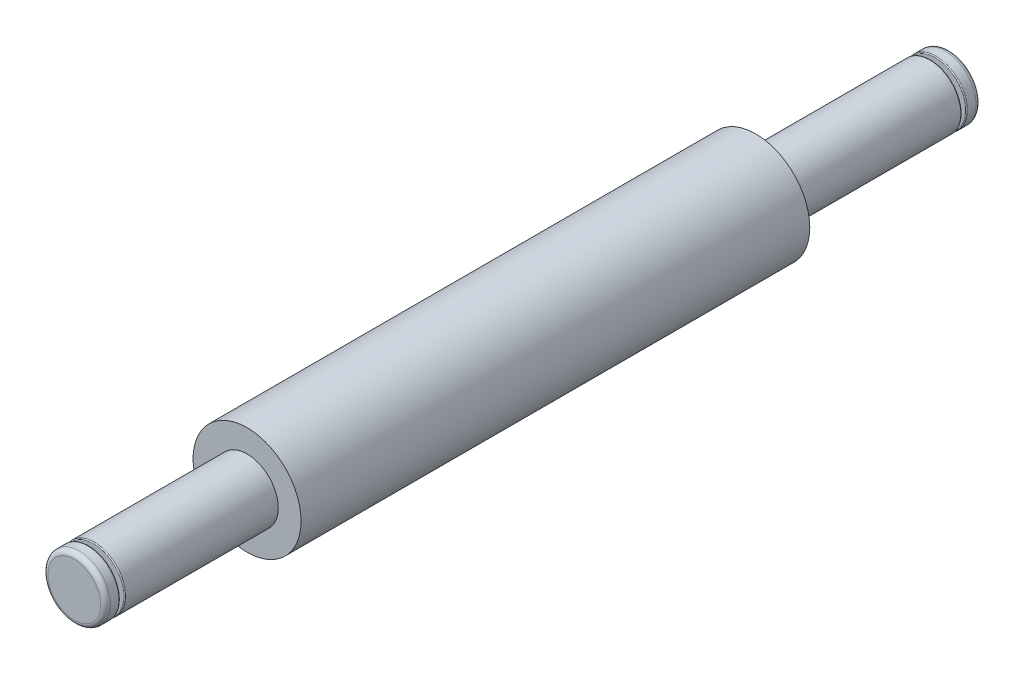
ISO-10303-21;
HEADER;
FILE_DESCRIPTION(('STEP AP214'),'2;1');
FILE_NAME('part.step','',(''),(''),'','','');
FILE_SCHEMA(('AUTOMOTIVE_DESIGN { 1 0 10303 214 1 1 1 1 }'));
ENDSEC;
DATA;
#1=APPLICATION_CONTEXT('core data for automotive mechanical design processes');
#2=APPLICATION_PROTOCOL_DEFINITION('international standard','automotive_design',2000,#1);
#3=PRODUCT_CONTEXT('',#1,'mechanical');
#4=PRODUCT('Part','Part','',(#3));
#5=PRODUCT_RELATED_PRODUCT_CATEGORY('part','',(#4));
#6=PRODUCT_DEFINITION_FORMATION('','',#4);
#7=PRODUCT_DEFINITION_CONTEXT('part definition',#1,'design');
#8=PRODUCT_DEFINITION('design','',#6,#7);
#9=PRODUCT_DEFINITION_SHAPE('','',#8);
#10=(LENGTH_UNIT() NAMED_UNIT(*) SI_UNIT(.MILLI.,.METRE.));
#11=(NAMED_UNIT(*) PLANE_ANGLE_UNIT() SI_UNIT($,.RADIAN.));
#12=(NAMED_UNIT(*) SI_UNIT($,.STERADIAN.) SOLID_ANGLE_UNIT());
#13=UNCERTAINTY_MEASURE_WITH_UNIT(LENGTH_MEASURE(1.E-05),#10,'distance_accuracy_value','');
#14=(GEOMETRIC_REPRESENTATION_CONTEXT(3) GLOBAL_UNCERTAINTY_ASSIGNED_CONTEXT((#13)) GLOBAL_UNIT_ASSIGNED_CONTEXT((#10,
#11,#12)) REPRESENTATION_CONTEXT('',''));
#15=CARTESIAN_POINT('',(0.,0.,0.));
#16=DIRECTION('',(0.,0.,1.));
#17=DIRECTION('',(1.,0.,0.));
#18=AXIS2_PLACEMENT_3D('',#15,#16,#17);
#19=CARTESIAN_POINT('',(-222.185360959143,59.6173462163521,-53.));
#20=DIRECTION('',(0.,0.,1.));
#21=DIRECTION('',(1.,0.,0.));
#22=AXIS2_PLACEMENT_3D('',#19,#20,#21);
#23=CYLINDRICAL_SURFACE('',#22,5.62500000000002);
#24=CARTESIAN_POINT('',(-222.185360959143,59.6173462163521,-53.));
#25=DIRECTION('',(0.,0.,1.));
#26=DIRECTION('',(1.,0.,0.));
#27=AXIS2_PLACEMENT_3D('',#24,#25,#26);
#28=CIRCLE('',#27,5.62500000000002);
#29=CARTESIAN_POINT('',(-216.560360959143,59.6173462163521,-53.));
#30=VERTEX_POINT('',#29);
#31=EDGE_CURVE('E80',#30,#30,#28,.T.);
#32=ORIENTED_EDGE('',*,*,#31,.T.);
#33=EDGE_LOOP('',(#32));
#34=FACE_BOUND('',#33,.T.);
#35=CARTESIAN_POINT('',(-222.185360959143,59.6173462163521,0.));
#36=DIRECTION('',(0.,0.,1.));
#37=DIRECTION('',(1.,0.,0.));
#38=AXIS2_PLACEMENT_3D('',#35,#36,#37);
#39=CIRCLE('',#38,5.62500000000002);
#40=CARTESIAN_POINT('',(-216.560360959143,59.6173462163521,0.));
#41=VERTEX_POINT('',#40);
#42=EDGE_CURVE('E81',#41,#41,#39,.T.);
#43=ORIENTED_EDGE('',*,*,#42,.F.);
#44=EDGE_LOOP('',(#43));
#45=FACE_BOUND('',#44,.T.);
#46=ADVANCED_FACE('F31',(#34,#45),#23,.T.);
#47=CARTESIAN_POINT('',(-222.185360959143,59.6173462163521,-53.));
#48=DIRECTION('',(0.,0.,1.));
#49=DIRECTION('',(1.,0.,0.));
#50=AXIS2_PLACEMENT_3D('',#47,#48,#49);
#51=PLANE('',#50);
#52=CARTESIAN_POINT('',(-222.185360959143,59.6173462163521,-53.));
#53=DIRECTION('',(0.,0.,1.));
#54=DIRECTION('',(1.,0.,0.));
#55=AXIS2_PLACEMENT_3D('',#52,#53,#54);
#56=CIRCLE('',#55,3.25000000000001);
#57=CARTESIAN_POINT('',(-218.935360959143,59.6173462163521,-53.));
#58=VERTEX_POINT('',#57);
#59=EDGE_CURVE('E84',#58,#58,#56,.T.);
#60=ORIENTED_EDGE('',*,*,#59,.T.);
#61=EDGE_LOOP('',(#60));
#62=FACE_BOUND('',#61,.T.);
#63=ORIENTED_EDGE('',*,*,#31,.F.);
#64=EDGE_LOOP('',(#63));
#65=FACE_BOUND('',#64,.T.);
#66=ADVANCED_FACE('F126',(#62,#65),#51,.F.);
#67=CARTESIAN_POINT('',(-222.185360959143,59.6173462163521,0.));
#68=DIRECTION('',(0.,0.,1.));
#69=DIRECTION('',(1.,0.,0.));
#70=AXIS2_PLACEMENT_3D('',#67,#68,#69);
#71=PLANE('',#70);
#72=CARTESIAN_POINT('',(-222.185360959143,59.6173462163521,0.));
#73=DIRECTION('',(0.,0.,1.));
#74=DIRECTION('',(1.,0.,0.));
#75=AXIS2_PLACEMENT_3D('',#72,#73,#74);
#76=CIRCLE('',#75,3.25000000000001);
#77=CARTESIAN_POINT('',(-218.935360959143,59.6173462163521,0.));
#78=VERTEX_POINT('',#77);
#79=EDGE_CURVE('E76',#78,#78,#76,.T.);
#80=ORIENTED_EDGE('',*,*,#79,.F.);
#81=EDGE_LOOP('',(#80));
#82=FACE_BOUND('',#81,.T.);
#83=ORIENTED_EDGE('',*,*,#42,.T.);
#84=EDGE_LOOP('',(#83));
#85=FACE_BOUND('',#84,.T.);
#86=ADVANCED_FACE('F132',(#82,#85),#71,.T.);
#87=CARTESIAN_POINT('',(-222.185360959143,59.6173462163521,16.));
#88=DIRECTION('',(0.,0.,1.));
#89=DIRECTION('',(1.,0.,0.));
#90=AXIS2_PLACEMENT_3D('',#87,#88,#89);
#91=PLANE('',#90);
#92=CARTESIAN_POINT('',(-222.185360959143,59.6173462163521,16.));
#93=DIRECTION('',(0.,0.,1.));
#94=DIRECTION('',(1.,0.,0.));
#95=AXIS2_PLACEMENT_3D('',#92,#93,#94);
#96=CIRCLE('',#95,3.15000000000001);
#97=CARTESIAN_POINT('',(-219.035360959143,59.6173462163521,16.));
#98=VERTEX_POINT('',#97);
#99=EDGE_CURVE('E54',#98,#98,#96,.T.);
#100=ORIENTED_EDGE('',*,*,#99,.T.);
#101=EDGE_LOOP('',(#100));
#102=FACE_BOUND('',#101,.T.);
#103=CARTESIAN_POINT('',(-222.185360959143,59.6173462163521,16.));
#104=DIRECTION('',(0.,0.,1.));
#105=DIRECTION('',(1.,0.,0.));
#106=AXIS2_PLACEMENT_3D('',#103,#104,#105);
#107=CIRCLE('',#106,1.75000000000001);
#108=CARTESIAN_POINT('',(-220.435360959143,59.6173462163521,16.));
#109=VERTEX_POINT('',#108);
#110=EDGE_CURVE('E79',#109,#109,#107,.T.);
#111=ORIENTED_EDGE('',*,*,#110,.F.);
#112=EDGE_LOOP('',(#111));
#113=FACE_BOUND('',#112,.T.);
#114=ADVANCED_FACE('F185',(#102,#113),#91,.T.);
#115=CARTESIAN_POINT('',(-222.185360959143,59.6173462163521,-71.2));
#116=DIRECTION('',(0.,0.,1.));
#117=DIRECTION('',(1.,0.,0.));
#118=AXIS2_PLACEMENT_3D('',#115,#116,#117);
#119=CYLINDRICAL_SURFACE('',#118,3.25000000000001);
#120=CARTESIAN_POINT('',(-222.185360959143,59.6173462163521,15.9));
#121=DIRECTION('',(0.,0.,1.));
#122=DIRECTION('',(1.,0.,0.));
#123=AXIS2_PLACEMENT_3D('',#120,#121,#122);
#124=CIRCLE('',#123,3.25000000000001);
#125=CARTESIAN_POINT('',(-218.935360959143,59.6173462163521,15.9));
#126=VERTEX_POINT('',#125);
#127=EDGE_CURVE('E51',#126,#126,#124,.F.);
#128=ORIENTED_EDGE('',*,*,#127,.T.);
#129=EDGE_LOOP('',(#128));
#130=FACE_BOUND('',#129,.T.);
#131=ORIENTED_EDGE('',*,*,#79,.T.);
#132=EDGE_LOOP('',(#131));
#133=FACE_BOUND('',#132,.T.);
#134=ADVANCED_FACE('F121',(#130,#133),#119,.T.);
#135=CARTESIAN_POINT('',(-222.185360959143,59.6173462163521,-71.1));
#136=DIRECTION('',(0.,0.,1.));
#137=DIRECTION('',(1.,0.,0.));
#138=AXIS2_PLACEMENT_3D('',#135,#136,#137);
#139=CIRCLE('',#138,3.25000000000001);
#140=CARTESIAN_POINT('',(-218.935360959143,59.6173462163521,-71.1));
#141=VERTEX_POINT('',#140);
#142=EDGE_CURVE('E72',#141,#141,#139,.T.);
#143=ORIENTED_EDGE('',*,*,#142,.T.);
#144=EDGE_LOOP('',(#143));
#145=FACE_BOUND('',#144,.T.);
#146=ORIENTED_EDGE('',*,*,#59,.F.);
#147=EDGE_LOOP('',(#146));
#148=FACE_BOUND('',#147,.T.);
#149=ADVANCED_FACE('F112',(#145,#148),#119,.T.);
#150=CARTESIAN_POINT('',(-222.185360959143,59.6173462163521,-71.2));
#151=DIRECTION('',(0.,0.,1.));
#152=DIRECTION('',(1.,0.,0.));
#153=AXIS2_PLACEMENT_3D('',#150,#151,#152);
#154=PLANE('',#153);
#155=CARTESIAN_POINT('',(-222.185360959143,59.6173462163521,-71.2));
#156=DIRECTION('',(0.,0.,1.));
#157=DIRECTION('',(1.,0.,0.));
#158=AXIS2_PLACEMENT_3D('',#155,#156,#157);
#159=CIRCLE('',#158,3.15000000000001);
#160=CARTESIAN_POINT('',(-219.035360959143,59.6173462163521,-71.2));
#161=VERTEX_POINT('',#160);
#162=EDGE_CURVE('E69',#161,#161,#159,.F.);
#163=ORIENTED_EDGE('',*,*,#162,.T.);
#164=EDGE_LOOP('',(#163));
#165=FACE_BOUND('',#164,.T.);
#166=CARTESIAN_POINT('',(-222.185360959143,59.6173462163521,-71.2));
#167=DIRECTION('',(0.,0.,-1.));
#168=DIRECTION('',(-1.,0.,0.));
#169=AXIS2_PLACEMENT_3D('',#166,#167,#168);
#170=CIRCLE('',#169,1.75000000000004);
#171=CARTESIAN_POINT('',(-223.935360959143,59.6173462163521,-71.2));
#172=VERTEX_POINT('',#171);
#173=EDGE_CURVE('E75',#172,#172,#170,.T.);
#174=ORIENTED_EDGE('',*,*,#173,.F.);
#175=EDGE_LOOP('',(#174));
#176=FACE_BOUND('',#175,.T.);
#177=ADVANCED_FACE('F110',(#165,#176),#154,.F.);
#178=CARTESIAN_POINT('',(-222.185360959143,59.6173462163521,16.5));
#179=DIRECTION('',(0.,0.,-1.));
#180=DIRECTION('',(-1.,0.,0.));
#181=AXIS2_PLACEMENT_3D('',#178,#179,#180);
#182=CYLINDRICAL_SURFACE('',#181,1.75000000000001);
#183=CARTESIAN_POINT('',(-222.185360959143,59.6173462163521,16.5));
#184=DIRECTION('',(0.,0.,1.));
#185=DIRECTION('',(1.,0.,0.));
#186=AXIS2_PLACEMENT_3D('',#183,#184,#185);
#187=CIRCLE('',#186,1.75000000000001);
#188=CARTESIAN_POINT('',(-220.435360959143,59.6173462163521,16.5));
#189=VERTEX_POINT('',#188);
#190=EDGE_CURVE('E89',#189,#189,#187,.T.);
#191=ORIENTED_EDGE('',*,*,#190,.F.);
#192=EDGE_LOOP('',(#191));
#193=FACE_BOUND('',#192,.T.);
#194=ORIENTED_EDGE('',*,*,#110,.T.);
#195=EDGE_LOOP('',(#194));
#196=FACE_BOUND('',#195,.T.);
#197=ADVANCED_FACE('F106',(#193,#196),#182,.T.);
#198=CARTESIAN_POINT('',(-222.185360959143,59.6173462163521,-71.7));
#199=DIRECTION('',(0.,0.,1.));
#200=DIRECTION('',(1.,0.,0.));
#201=AXIS2_PLACEMENT_3D('',#198,#199,#200);
#202=CYLINDRICAL_SURFACE('',#201,1.75000000000004);
#203=CARTESIAN_POINT('',(-222.185360959143,59.6173462163521,-71.7));
#204=DIRECTION('',(0.,0.,-1.));
#205=DIRECTION('',(-1.,0.,0.));
#206=AXIS2_PLACEMENT_3D('',#203,#204,#205);
#207=CIRCLE('',#206,1.75000000000004);
#208=CARTESIAN_POINT('',(-223.935360959143,59.6173462163521,-71.7));
#209=VERTEX_POINT('',#208);
#210=EDGE_CURVE('E94',#209,#209,#207,.T.);
#211=ORIENTED_EDGE('',*,*,#210,.F.);
#212=EDGE_LOOP('',(#211));
#213=FACE_BOUND('',#212,.T.);
#214=ORIENTED_EDGE('',*,*,#173,.T.);
#215=EDGE_LOOP('',(#214));
#216=FACE_BOUND('',#215,.T.);
#217=ADVANCED_FACE('F102',(#213,#216),#202,.T.);
#218=CARTESIAN_POINT('',(-222.185360959143,59.6173462163521,-73.2));
#219=DIRECTION('',(0.,0.,1.));
#220=DIRECTION('',(1.,0.,0.));
#221=AXIS2_PLACEMENT_3D('',#218,#219,#220);
#222=CYLINDRICAL_SURFACE('',#221,3.25000000000001);
#223=CARTESIAN_POINT('',(-222.185360959143,59.6173462163521,-72.7));
#224=DIRECTION('',(0.,0.,-1.));
#225=DIRECTION('',(-1.,0.,0.));
#226=AXIS2_PLACEMENT_3D('',#223,#224,#225);
#227=CIRCLE('',#226,3.25000000000001);
#228=CARTESIAN_POINT('',(-225.435360959143,59.6173462163521,-72.7));
#229=VERTEX_POINT('',#228);
#230=EDGE_CURVE('E10',#229,#229,#227,.F.);
#231=ORIENTED_EDGE('',*,*,#230,.T.);
#232=EDGE_LOOP('',(#231));
#233=FACE_BOUND('',#232,.T.);
#234=CARTESIAN_POINT('',(-222.185360959143,59.6173462163521,-71.8));
#235=DIRECTION('',(0.,0.,-1.));
#236=DIRECTION('',(-1.,0.,0.));
#237=AXIS2_PLACEMENT_3D('',#234,#235,#236);
#238=CIRCLE('',#237,3.25000000000001);
#239=CARTESIAN_POINT('',(-225.435360959143,59.6173462163521,-71.8));
#240=VERTEX_POINT('',#239);
#241=EDGE_CURVE('E66',#240,#240,#238,.T.);
#242=ORIENTED_EDGE('',*,*,#241,.T.);
#243=EDGE_LOOP('',(#242));
#244=FACE_BOUND('',#243,.T.);
#245=ADVANCED_FACE('F105',(#233,#244),#222,.T.);
#246=CARTESIAN_POINT('',(-222.185360959143,59.6173462163521,-73.2));
#247=DIRECTION('',(0.,0.,-1.));
#248=DIRECTION('',(-1.,0.,0.));
#249=AXIS2_PLACEMENT_3D('',#246,#247,#248);
#250=PLANE('',#249);
#251=CARTESIAN_POINT('',(-222.185360959143,59.6173462163521,-73.2));
#252=DIRECTION('',(0.,0.,-1.));
#253=DIRECTION('',(-1.,0.,0.));
#254=AXIS2_PLACEMENT_3D('',#251,#252,#253);
#255=CIRCLE('',#254,2.75000000000001);
#256=CARTESIAN_POINT('',(-224.935360959143,59.6173462163521,-73.2));
#257=VERTEX_POINT('',#256);
#258=EDGE_CURVE('E38',#257,#257,#255,.T.);
#259=ORIENTED_EDGE('',*,*,#258,.T.);
#260=EDGE_LOOP('',(#259));
#261=FACE_BOUND('',#260,.T.);
#262=ADVANCED_FACE('F178',(#261),#250,.T.);
#263=CARTESIAN_POINT('',(-222.185360959143,59.6173462163521,-71.7));
#264=DIRECTION('',(0.,0.,-1.));
#265=DIRECTION('',(-1.,0.,0.));
#266=AXIS2_PLACEMENT_3D('',#263,#264,#265);
#267=PLANE('',#266);
#268=CARTESIAN_POINT('',(-222.185360959143,59.6173462163521,-71.7));
#269=DIRECTION('',(0.,0.,-1.));
#270=DIRECTION('',(-1.,0.,0.));
#271=AXIS2_PLACEMENT_3D('',#268,#269,#270);
#272=CIRCLE('',#271,3.15000000000001);
#273=CARTESIAN_POINT('',(-225.335360959143,59.6173462163521,-71.7));
#274=VERTEX_POINT('',#273);
#275=EDGE_CURVE('E63',#274,#274,#272,.F.);
#276=ORIENTED_EDGE('',*,*,#275,.T.);
#277=EDGE_LOOP('',(#276));
#278=FACE_BOUND('',#277,.T.);
#279=ORIENTED_EDGE('',*,*,#210,.T.);
#280=EDGE_LOOP('',(#279));
#281=FACE_BOUND('',#280,.T.);
#282=ADVANCED_FACE('F100',(#278,#281),#267,.F.);
#283=CARTESIAN_POINT('',(-222.185360959143,59.6173462163521,18.));
#284=DIRECTION('',(0.,0.,-1.));
#285=DIRECTION('',(-1.,0.,0.));
#286=AXIS2_PLACEMENT_3D('',#283,#284,#285);
#287=CYLINDRICAL_SURFACE('',#286,3.25000000000001);
#288=CARTESIAN_POINT('',(-222.185360959143,59.6173462163521,17.5));
#289=DIRECTION('',(0.,0.,1.));
#290=DIRECTION('',(1.,0.,0.));
#291=AXIS2_PLACEMENT_3D('',#288,#289,#290);
#292=CIRCLE('',#291,3.25000000000001);
#293=CARTESIAN_POINT('',(-218.935360959143,59.6173462163521,17.5));
#294=VERTEX_POINT('',#293);
#295=EDGE_CURVE('E42',#294,#294,#292,.F.);
#296=ORIENTED_EDGE('',*,*,#295,.T.);
#297=EDGE_LOOP('',(#296));
#298=FACE_BOUND('',#297,.T.);
#299=CARTESIAN_POINT('',(-222.185360959143,59.6173462163521,16.6));
#300=DIRECTION('',(0.,0.,1.));
#301=DIRECTION('',(1.,0.,0.));
#302=AXIS2_PLACEMENT_3D('',#299,#300,#301);
#303=CIRCLE('',#302,3.25000000000001);
#304=CARTESIAN_POINT('',(-218.935360959143,59.6173462163521,16.6));
#305=VERTEX_POINT('',#304);
#306=EDGE_CURVE('E60',#305,#305,#303,.T.);
#307=ORIENTED_EDGE('',*,*,#306,.T.);
#308=EDGE_LOOP('',(#307));
#309=FACE_BOUND('',#308,.T.);
#310=ADVANCED_FACE('F167',(#298,#309),#287,.T.);
#311=CARTESIAN_POINT('',(-222.185360959143,59.6173462163521,18.));
#312=DIRECTION('',(0.,0.,1.));
#313=DIRECTION('',(1.,0.,0.));
#314=AXIS2_PLACEMENT_3D('',#311,#312,#313);
#315=PLANE('',#314);
#316=CARTESIAN_POINT('',(-222.185360959143,59.6173462163521,18.));
#317=DIRECTION('',(0.,0.,1.));
#318=DIRECTION('',(1.,0.,0.));
#319=AXIS2_PLACEMENT_3D('',#316,#317,#318);
#320=CIRCLE('',#319,2.75000000000001);
#321=CARTESIAN_POINT('',(-219.435360959143,59.6173462163521,18.));
#322=VERTEX_POINT('',#321);
#323=EDGE_CURVE('E46',#322,#322,#320,.T.);
#324=ORIENTED_EDGE('',*,*,#323,.T.);
#325=EDGE_LOOP('',(#324));
#326=FACE_BOUND('',#325,.T.);
#327=ADVANCED_FACE('F165',(#326),#315,.T.);
#328=CARTESIAN_POINT('',(-222.185360959143,59.6173462163521,16.5));
#329=DIRECTION('',(0.,0.,1.));
#330=DIRECTION('',(1.,0.,0.));
#331=AXIS2_PLACEMENT_3D('',#328,#329,#330);
#332=PLANE('',#331);
#333=CARTESIAN_POINT('',(-222.185360959143,59.6173462163521,16.5));
#334=DIRECTION('',(0.,0.,1.));
#335=DIRECTION('',(1.,0.,0.));
#336=AXIS2_PLACEMENT_3D('',#333,#334,#335);
#337=CIRCLE('',#336,3.15000000000001);
#338=CARTESIAN_POINT('',(-219.035360959143,59.6173462163521,16.5));
#339=VERTEX_POINT('',#338);
#340=EDGE_CURVE('E57',#339,#339,#337,.F.);
#341=ORIENTED_EDGE('',*,*,#340,.T.);
#342=EDGE_LOOP('',(#341));
#343=FACE_BOUND('',#342,.T.);
#344=ORIENTED_EDGE('',*,*,#190,.T.);
#345=EDGE_LOOP('',(#344));
#346=FACE_BOUND('',#345,.T.);
#347=ADVANCED_FACE('F142',(#343,#346),#332,.F.);
#348=CARTESIAN_POINT('',(-222.185360959143,59.6173462163521,-71.1));
#349=DIRECTION('',(0.,0.,1.));
#350=DIRECTION('',(1.,0.,0.));
#351=AXIS2_PLACEMENT_3D('',#348,#349,#350);
#352=TOROIDAL_SURFACE('',#351,3.15000000000001,0.1);
#353=ORIENTED_EDGE('',*,*,#162,.F.);
#354=EDGE_LOOP('',(#353));
#355=FACE_BOUND('',#354,.T.);
#356=ORIENTED_EDGE('',*,*,#142,.F.);
#357=EDGE_LOOP('',(#356));
#358=FACE_BOUND('',#357,.T.);
#359=ADVANCED_FACE('F138',(#355,#358),#352,.T.);
#360=CARTESIAN_POINT('',(-222.185360959143,59.6173462163521,-71.8));
#361=DIRECTION('',(0.,0.,-1.));
#362=DIRECTION('',(-1.,0.,0.));
#363=AXIS2_PLACEMENT_3D('',#360,#361,#362);
#364=TOROIDAL_SURFACE('',#363,3.15000000000001,0.1);
#365=ORIENTED_EDGE('',*,*,#275,.F.);
#366=EDGE_LOOP('',(#365));
#367=FACE_BOUND('',#366,.T.);
#368=ORIENTED_EDGE('',*,*,#241,.F.);
#369=EDGE_LOOP('',(#368));
#370=FACE_BOUND('',#369,.T.);
#371=ADVANCED_FACE('F141',(#367,#370),#364,.T.);
#372=CARTESIAN_POINT('',(-222.185360959143,59.6173462163521,16.6));
#373=DIRECTION('',(0.,0.,1.));
#374=DIRECTION('',(1.,0.,0.));
#375=AXIS2_PLACEMENT_3D('',#372,#373,#374);
#376=TOROIDAL_SURFACE('',#375,3.15000000000001,0.1);
#377=ORIENTED_EDGE('',*,*,#340,.F.);
#378=EDGE_LOOP('',(#377));
#379=FACE_BOUND('',#378,.T.);
#380=ORIENTED_EDGE('',*,*,#306,.F.);
#381=EDGE_LOOP('',(#380));
#382=FACE_BOUND('',#381,.T.);
#383=ADVANCED_FACE('F146',(#379,#382),#376,.T.);
#384=CARTESIAN_POINT('',(-222.185360959143,59.6173462163521,15.9));
#385=DIRECTION('',(0.,0.,1.));
#386=DIRECTION('',(1.,0.,0.));
#387=AXIS2_PLACEMENT_3D('',#384,#385,#386);
#388=TOROIDAL_SURFACE('',#387,3.15000000000001,0.1);
#389=ORIENTED_EDGE('',*,*,#127,.F.);
#390=EDGE_LOOP('',(#389));
#391=FACE_BOUND('',#390,.T.);
#392=ORIENTED_EDGE('',*,*,#99,.F.);
#393=EDGE_LOOP('',(#392));
#394=FACE_BOUND('',#393,.T.);
#395=ADVANCED_FACE('F150',(#391,#394),#388,.T.);
#396=CARTESIAN_POINT('',(-222.185360959143,59.6173462163521,17.5));
#397=DIRECTION('',(0.,0.,1.));
#398=DIRECTION('',(1.,0.,0.));
#399=AXIS2_PLACEMENT_3D('',#396,#397,#398);
#400=TOROIDAL_SURFACE('',#399,2.75000000000001,0.5);
#401=ORIENTED_EDGE('',*,*,#295,.F.);
#402=EDGE_LOOP('',(#401));
#403=FACE_BOUND('',#402,.T.);
#404=ORIENTED_EDGE('',*,*,#323,.F.);
#405=EDGE_LOOP('',(#404));
#406=FACE_BOUND('',#405,.T.);
#407=ADVANCED_FACE('F153',(#403,#406),#400,.T.);
#408=CARTESIAN_POINT('',(-222.185360959143,59.6173462163521,-72.7));
#409=DIRECTION('',(0.,0.,-1.));
#410=DIRECTION('',(-1.,0.,0.));
#411=AXIS2_PLACEMENT_3D('',#408,#409,#410);
#412=TOROIDAL_SURFACE('',#411,2.75000000000001,0.5);
#413=ORIENTED_EDGE('',*,*,#230,.F.);
#414=EDGE_LOOP('',(#413));
#415=FACE_BOUND('',#414,.T.);
#416=ORIENTED_EDGE('',*,*,#258,.F.);
#417=EDGE_LOOP('',(#416));
#418=FACE_BOUND('',#417,.T.);
#419=ADVANCED_FACE('F33',(#415,#418),#412,.T.);
#420=CLOSED_SHELL('',(#46,#66,#86,#114,#134,#149,#177,#197,#217,#245,#262,#282,#310,#327,#347,
#359,#371,#383,#395,#407,#419));
#421=MANIFOLD_SOLID_BREP('B2',#420);
#422=ADVANCED_BREP_SHAPE_REPRESENTATION('',(#18,#421),#14);
#423=SHAPE_DEFINITION_REPRESENTATION(#9,#422);
ENDSEC;
END-ISO-10303-21;
